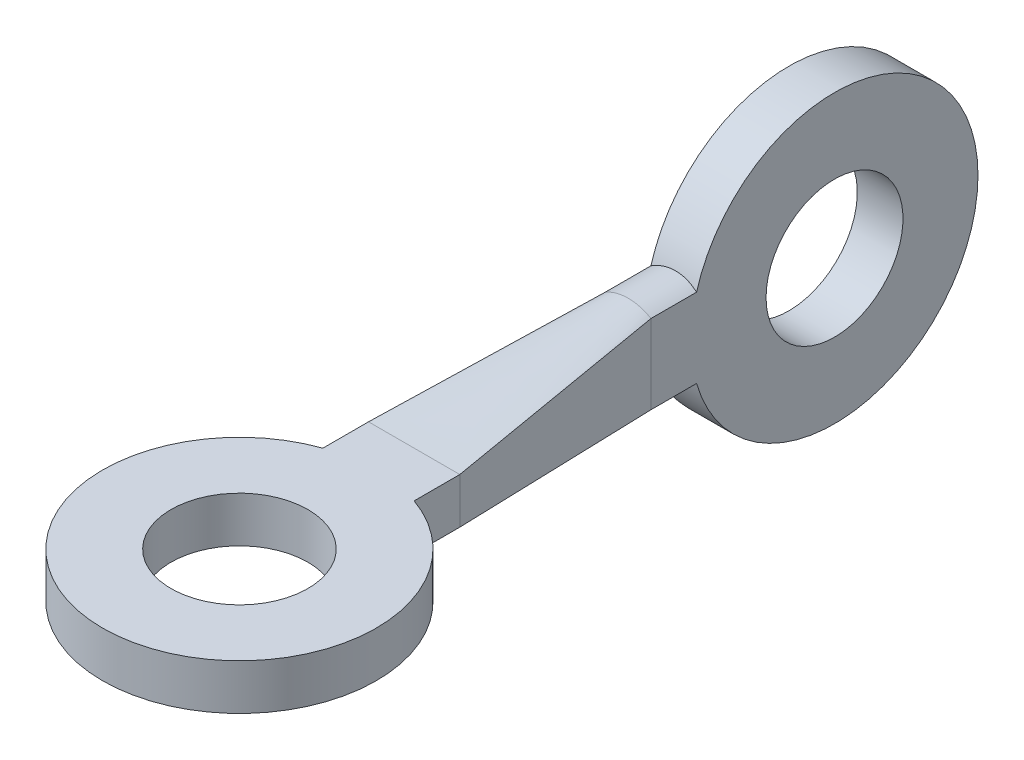
ISO-10303-21;
HEADER;
FILE_DESCRIPTION(('STEP AP214'),'2;1');
FILE_NAME('part.step','',(''),(''),'','','');
FILE_SCHEMA(('AUTOMOTIVE_DESIGN { 1 0 10303 214 1 1 1 1 }'));
ENDSEC;
DATA;
#1=APPLICATION_CONTEXT('core data for automotive mechanical design processes');
#2=APPLICATION_PROTOCOL_DEFINITION('international standard','automotive_design',2000,#1);
#3=PRODUCT_CONTEXT('',#1,'mechanical');
#4=PRODUCT('Part','Part','',(#3));
#5=PRODUCT_RELATED_PRODUCT_CATEGORY('part','',(#4));
#6=PRODUCT_DEFINITION_FORMATION('','',#4);
#7=PRODUCT_DEFINITION_CONTEXT('part definition',#1,'design');
#8=PRODUCT_DEFINITION('design','',#6,#7);
#9=PRODUCT_DEFINITION_SHAPE('','',#8);
#10=(LENGTH_UNIT() NAMED_UNIT(*) SI_UNIT(.MILLI.,.METRE.));
#11=(NAMED_UNIT(*) PLANE_ANGLE_UNIT() SI_UNIT($,.RADIAN.));
#12=(NAMED_UNIT(*) SI_UNIT($,.STERADIAN.) SOLID_ANGLE_UNIT());
#13=UNCERTAINTY_MEASURE_WITH_UNIT(LENGTH_MEASURE(1.E-05),#10,'distance_accuracy_value','');
#14=(GEOMETRIC_REPRESENTATION_CONTEXT(3) GLOBAL_UNCERTAINTY_ASSIGNED_CONTEXT((#13)) GLOBAL_UNIT_ASSIGNED_CONTEXT((#10,
#11,#12)) REPRESENTATION_CONTEXT('',''));
#15=CARTESIAN_POINT('',(0.,0.,0.));
#16=DIRECTION('',(0.,0.,1.));
#17=DIRECTION('',(1.,0.,0.));
#18=AXIS2_PLACEMENT_3D('',#15,#16,#17);
#19=CARTESIAN_POINT('',(0.,0.,40.));
#20=DIRECTION('',(0.,0.,-1.));
#21=DIRECTION('',(-1.,0.,0.));
#22=AXIS2_PLACEMENT_3D('',#19,#20,#21);
#23=CYLINDRICAL_SURFACE('',#22,2.);
#24=DIRECTION('',(0.,0.,1.));
#25=VECTOR('',#24,1.);
#26=CARTESIAN_POINT('',(1.,-1.73205080756888,-50.));
#27=LINE('',#26,#25);
#28=CARTESIAN_POINT('',(1.,-1.73205080756888,-49.9167094194033));
#29=VERTEX_POINT('',#28);
#30=CARTESIAN_POINT('',(1.,-1.73205080756888,-47.9202689102537));
#31=VERTEX_POINT('',#30);
#32=EDGE_CURVE('E279',#29,#31,#27,.T.);
#33=ORIENTED_EDGE('',*,*,#32,.T.);
#34=CARTESIAN_POINT('',(-0.999999999999999,-1.73205080756888,-47.9202689102538));
#35=CARTESIAN_POINT('',(-0.855662432702592,-1.81538414090221,-47.9202689102538));
#36=CARTESIAN_POINT('',(-0.695743587419121,-1.88327776752472,-47.9202689102538));
#37=CARTESIAN_POINT('',(-0.357154511713669,-1.97566063478784,-47.9202689102538));
#38=CARTESIAN_POINT('',(-0.17863279495408,-2.,-47.9202689102537));
#39=CARTESIAN_POINT('',(0.178632794954083,-2.,-47.9202689102538));
#40=CARTESIAN_POINT('',(0.357154511713672,-1.97566063478784,-47.9202689102538));
#41=CARTESIAN_POINT('',(0.695743587419124,-1.88327776752472,-47.9202689102538));
#42=CARTESIAN_POINT('',(0.855662432702595,-1.81538414090221,-47.9202689102538));
#43=CARTESIAN_POINT('',(1.,-1.73205080756888,-47.9202689102538));
#44=B_SPLINE_CURVE_WITH_KNOTS('',3,(#34,#35,#36,#37,#38,#39,#40,#41,#42,#43),.UNSPECIFIED.,.F.,
.F.,(4,2,2,2,4),(0.,0.25,0.5,0.75,1.),.UNSPECIFIED.);
#45=CARTESIAN_POINT('',(-0.999999999999999,-1.73205080756888,-47.9202689102538));
#46=VERTEX_POINT('',#45);
#47=EDGE_CURVE('E268',#31,#46,#44,.F.);
#48=ORIENTED_EDGE('',*,*,#47,.T.);
#49=DIRECTION('',(0.,0.,1.));
#50=VECTOR('',#49,1.);
#51=CARTESIAN_POINT('',(-1.,-1.73205080756888,-50.));
#52=LINE('',#51,#50);
#53=CARTESIAN_POINT('',(-1.,-1.73205080756888,-49.9167094194033));
#54=VERTEX_POINT('',#53);
#55=EDGE_CURVE('E63',#54,#46,#52,.T.);
#56=ORIENTED_EDGE('',*,*,#55,.F.);
#57=CARTESIAN_POINT('',(-2.,0.,-49.6734537981822));
#58=CARTESIAN_POINT('',(-1.99999958670003,-0.10940427922408,-49.6734541409433));
#59=CARTESIAN_POINT('',(-1.99099353960918,-0.218813304824866,-49.6763358688211));
#60=CARTESIAN_POINT('',(-1.95530584204708,-0.434425696098227,-49.6875489350859));
#61=CARTESIAN_POINT('',(-1.92862076452526,-0.540628436063382,-49.6958813300717));
#62=CARTESIAN_POINT('',(-1.85857027585872,-0.746688169215067,-49.7170867440767));
#63=CARTESIAN_POINT('',(-1.81523122951393,-0.846554903212941,-49.7299525835668));
#64=CARTESIAN_POINT('',(-1.71321704939282,-1.03760346199317,-49.7589004731303));
#65=CARTESIAN_POINT('',(-1.6545393336673,-1.12878382107406,-49.7749830645705));
#66=CARTESIAN_POINT('',(-1.52154589272172,-1.30277786649985,-49.8092344806702));
#67=CARTESIAN_POINT('',(-1.44682938468678,-1.38527598771562,-49.8274499619818));
#68=CARTESIAN_POINT('',(-1.2847322898229,-1.53680731356874,-49.8636475231072));
#69=CARTESIAN_POINT('',(-1.19734924257694,-1.60583789607319,-49.8816295568339));
#70=CARTESIAN_POINT('',(-1.00963926857056,-1.73020911334308,-49.9158281566154));
#71=CARTESIAN_POINT('',(-0.909036930347378,-1.78515136439131,-49.9319873236863));
#72=CARTESIAN_POINT('',(-0.699423233123488,-1.8772052413375,-49.960006841113));
#73=CARTESIAN_POINT('',(-0.590414189551318,-1.9143217567019,-49.9718683700596));
#74=CARTESIAN_POINT('',(-0.370649883361726,-1.96850822632186,-49.9894607287453));
#75=CARTESIAN_POINT('',(-0.260054082930835,-1.98616514667777,-49.9953705735451));
#76=CARTESIAN_POINT('',(-0.037324061015967,-2.00276531693824,-50.0009214261652));
#77=CARTESIAN_POINT('',(0.0748097259026973,-2.0017137484355,-50.0005641697524));
#78=CARTESIAN_POINT('',(0.29253866135017,-1.98138499683073,-49.9937789041836));
#79=CARTESIAN_POINT('',(0.398213073159152,-1.96285905377728,-49.9876011366861));
#80=CARTESIAN_POINT('',(0.604868116530266,-1.90932742516246,-49.9702782230478));
#81=CARTESIAN_POINT('',(0.705848231528714,-1.87431993065399,-49.9591325316552));
#82=CARTESIAN_POINT('',(0.902016076891211,-1.7882986691208,-49.9329413867494));
#83=CARTESIAN_POINT('',(0.997094102147248,-1.73705251719816,-49.9178399046554));
#84=CARTESIAN_POINT('',(1.17754541961867,-1.62016998865725,-49.8854638290231));
#85=CARTESIAN_POINT('',(1.26291610608373,-1.55452976200595,-49.8681886546076));
#86=CARTESIAN_POINT('',(1.42576989058637,-1.40705647447919,-49.8324128265761));
#87=CARTESIAN_POINT('',(1.5026895935095,-1.32460477849631,-49.8138928398112));
#88=CARTESIAN_POINT('',(1.6417498461887,-1.14774240790991,-49.7784325954715));
#89=CARTESIAN_POINT('',(1.70388922095101,-1.05333078344009,-49.7614924635558));
#90=CARTESIAN_POINT('',(1.81202514639368,-0.854114354785136,-49.730911592378));
#91=CARTESIAN_POINT('',(1.85788300117446,-0.749229570491273,-49.7172994946648));
#92=CARTESIAN_POINT('',(1.93113486538348,-0.532700073873293,-49.6951154118477));
#93=CARTESIAN_POINT('',(1.95853469132195,-0.421057503166261,-49.6865418391082));
#94=CARTESIAN_POINT('',(1.99312298969863,-0.198960469831808,-49.6756582643694));
#95=CARTESIAN_POINT('',(2.00107378392374,-0.0886361277998476,-49.6731121469158));
#96=CARTESIAN_POINT('',(1.99869348561917,0.131784600607327,-49.6738694714018));
#97=CARTESIAN_POINT('',(1.98836517070802,0.241881019071757,-49.6771720246014));
#98=CARTESIAN_POINT('',(1.95032964832314,0.455751361897044,-49.6891002440258));
#99=CARTESIAN_POINT('',(1.92307978298282,0.559615195436825,-49.6975857340805));
#100=CARTESIAN_POINT('',(1.85253631785648,0.761264458498393,-49.7188816185392));
#101=CARTESIAN_POINT('',(1.80924071646146,0.859049127903185,-49.7316925524984));
#102=CARTESIAN_POINT('',(1.70663143021575,1.04847548655247,-49.7607234783946));
#103=CARTESIAN_POINT('',(1.64694554719556,1.13990343587809,-49.7770204512685));
#104=CARTESIAN_POINT('',(1.51369400513522,1.31169963636845,-49.8111638102764));
#105=CARTESIAN_POINT('',(1.44012445435076,1.39206477555591,-49.8290106300904));
#106=CARTESIAN_POINT('',(1.27760775700532,1.54288860123637,-49.8651681565011));
#107=CARTESIAN_POINT('',(1.18815247044756,1.61280367907205,-49.883467739279));
#108=CARTESIAN_POINT('',(0.998382364090376,1.73668365743214,-49.9176959440001));
#109=CARTESIAN_POINT('',(0.898067656355469,1.79064872253235,-49.9336245904062));
#110=CARTESIAN_POINT('',(0.689574550646603,1.88078048347262,-49.9611351354301));
#111=CARTESIAN_POINT('',(0.581424767839512,1.91700853465307,-49.9727319849812));
#112=CARTESIAN_POINT('',(0.3601128402312,1.97060087749928,-49.9901496304489));
#113=CARTESIAN_POINT('',(0.246952710845481,1.98797268363016,-49.9959727272029));
#114=CARTESIAN_POINT('',(0.0245317466317054,2.00280723060671,-50.000937971976));
#115=CARTESIAN_POINT('',(-0.0846634488093431,2.00116442762922,-50.0003802895932));
#116=CARTESIAN_POINT('',(-0.301138930988915,1.98018666513643,-49.9933794113894));
#117=CARTESIAN_POINT('',(-0.408419312903888,1.9608525874826,-49.9869365089304));
#118=CARTESIAN_POINT('',(-0.616357174049056,1.90564917251096,-49.969104592412));
#119=CARTESIAN_POINT('',(-0.717092257773487,1.87004456532375,-49.9577949288054));
#120=CARTESIAN_POINT('',(-0.911238592146622,1.78352063125023,-49.9315265246381));
#121=CARTESIAN_POINT('',(-1.00464831019334,1.73259811029261,-49.916567023141));
#122=CARTESIAN_POINT('',(-1.18557149015125,1.61448352146309,-49.883931962669));
#123=CARTESIAN_POINT('',(-1.27269525765263,1.5467181588876,-49.8661712006051));
#124=CARTESIAN_POINT('',(-1.43462411871266,1.39783983796085,-49.8303171654653));
#125=CARTESIAN_POINT('',(-1.50942585866384,1.31672325786344,-49.8122238033522));
#126=CARTESIAN_POINT('',(-1.64715783792152,1.14010260243019,-49.7769993359435));
#127=CARTESIAN_POINT('',(-1.70959348727804,1.04420078347311,-49.7599224441907));
#128=CARTESIAN_POINT('',(-1.8173777437294,0.842721033412805,-49.7293496789503));
#129=CARTESIAN_POINT('',(-1.86273246888567,0.737146583739254,-49.7158525237826));
#130=CARTESIAN_POINT('',(-1.93213189839561,0.527399324323273,-49.6947906849293));
#131=CARTESIAN_POINT('',(-1.95750704908768,0.423702740779572,-49.6868604054561));
#132=CARTESIAN_POINT('',(-1.99143945048468,0.213338502760021,-49.6761923664431));
#133=CARTESIAN_POINT('',(-2.00000040297629,0.106671507490969,-49.6734534639827));
#134=CARTESIAN_POINT('',(-2.,0.,-49.6734537981822));
#135=B_SPLINE_CURVE_WITH_KNOTS('',3,(#57,#58,#59,#60,#61,#62,#63,#64,#65,#66,#67,#68,#69,#70,
#71,#72,#73,#74,#75,#76,#77,#78,#79,#80,#81,#82,#83,#84,#85,#86,#87,#88,#89,#90,#91,#92,#93,#94,
#95,#96,#97,#98,#99,#100,#101,#102,#103,#104,#105,#106,#107,#108,#109,#110,#111,#112,#113,#114,
#115,#116,#117,#118,#119,#120,#121,#122,#123,#124,#125,#126,#127,#128,#129,#130,#131,#132,#133,
#134),.UNSPECIFIED.,.T.,.F.,(4,2,2,2,2,2,2,2,2,2,2,2,2,2,2,2,2,2,2,2,2,2,2,2,2,2,2,2,2,2,2,2,2,
2,2,2,2,2,4),(0.,0.327820628580541,0.655704823244681,0.983072070686562,1.3104944591894,
1.64732198851296,1.98421503293001,2.32978494808253,2.67526002177035,3.01000216474727,
3.34465159738033,3.66553979346283,3.98646321712342,4.31220408633315,4.63803218908533,
4.97925793983085,5.32051080798706,5.66460461185119,6.00858993378931,6.33885960016352,
6.66907908442112,6.99074034514751,7.31244174469331,7.64215795577247,7.971966727574,
8.31534461543778,8.65871896012813,9.00089697157971,9.34293857040924,9.66895839721077,
9.99496197370422,10.3158404308718,10.6367858436304,10.9706741882154,11.3046532554536,
11.6500758990744,11.995374700952,12.3150772042684,12.6347093145052),.UNSPECIFIED.);
#136=EDGE_CURVE('E274',#54,#29,#135,.T.);
#137=ORIENTED_EDGE('',*,*,#136,.T.);
#138=EDGE_LOOP('',(#33,#48,#56,#137));
#139=FACE_BOUND('',#138,.T.);
#140=ADVANCED_FACE('F53',(#139),#23,.T.);
#141=CARTESIAN_POINT('',(-1.,-1.73205080756888,-50.));
#142=DIRECTION('',(1.,0.,0.));
#143=DIRECTION('',(0.,0.,-1.));
#144=AXIS2_PLACEMENT_3D('',#141,#142,#143);
#145=PLANE('',#144);
#146=CARTESIAN_POINT('',(-1.,0.,-55.9614344867655));
#147=DIRECTION('',(-1.,0.,0.));
#148=DIRECTION('',(0.,0.,1.));
#149=AXIS2_PLACEMENT_3D('',#146,#147,#148);
#150=CIRCLE('',#149,3.);
#151=CARTESIAN_POINT('',(-1.,0.,-52.9614344867655));
#152=VERTEX_POINT('',#151);
#153=EDGE_CURVE('E265',#152,#152,#150,.T.);
#154=ORIENTED_EDGE('',*,*,#153,.F.);
#155=EDGE_LOOP('',(#154));
#156=FACE_BOUND('',#155,.T.);
#157=ORIENTED_EDGE('',*,*,#55,.T.);
#158=DIRECTION('',(0.,1.,0.));
#159=VECTOR('',#158,1.);
#160=CARTESIAN_POINT('',(-1.,0.,-47.9202689102538));
#161=LINE('',#160,#159);
#162=CARTESIAN_POINT('',(-1.,1.73205080756888,-47.9202689102538));
#163=VERTEX_POINT('',#162);
#164=EDGE_CURVE('E211',#163,#46,#161,.F.);
#165=ORIENTED_EDGE('',*,*,#164,.F.);
#166=DIRECTION('',(0.,0.,1.));
#167=VECTOR('',#166,1.);
#168=CARTESIAN_POINT('',(-1.,1.73205080756888,-50.));
#169=LINE('',#168,#167);
#170=CARTESIAN_POINT('',(-1.,1.73205080756888,-49.9167094194033));
#171=VERTEX_POINT('',#170);
#172=EDGE_CURVE('E303',#171,#163,#169,.T.);
#173=ORIENTED_EDGE('',*,*,#172,.F.);
#174=CARTESIAN_POINT('',(-1.,0.,-55.9614344867655));
#175=DIRECTION('',(-1.,0.,0.));
#176=DIRECTION('',(0.,0.,1.));
#177=AXIS2_PLACEMENT_3D('',#174,#175,#176);
#178=CIRCLE('',#177,6.28798068858332);
#179=EDGE_CURVE('E264',#171,#54,#178,.T.);
#180=ORIENTED_EDGE('',*,*,#179,.T.);
#181=EDGE_LOOP('',(#157,#165,#173,#180));
#182=FACE_BOUND('',#181,.T.);
#183=ADVANCED_FACE('F292',(#156,#182),#145,.F.);
#184=CARTESIAN_POINT('',(1.,-1.73205080756888,-50.));
#185=DIRECTION('',(-1.,0.,0.));
#186=DIRECTION('',(0.,0.,1.));
#187=AXIS2_PLACEMENT_3D('',#184,#185,#186);
#188=PLANE('',#187);
#189=CARTESIAN_POINT('',(1.,0.,-55.9614344867655));
#190=DIRECTION('',(-1.,0.,0.));
#191=DIRECTION('',(0.,0.,1.));
#192=AXIS2_PLACEMENT_3D('',#189,#190,#191);
#193=CIRCLE('',#192,3.);
#194=CARTESIAN_POINT('',(1.,0.,-52.9614344867655));
#195=VERTEX_POINT('',#194);
#196=EDGE_CURVE('E261',#195,#195,#193,.T.);
#197=ORIENTED_EDGE('',*,*,#196,.T.);
#198=EDGE_LOOP('',(#197));
#199=FACE_BOUND('',#198,.T.);
#200=DIRECTION('',(0.,0.,1.));
#201=VECTOR('',#200,1.);
#202=CARTESIAN_POINT('',(1.,1.73205080756888,-50.));
#203=LINE('',#202,#201);
#204=CARTESIAN_POINT('',(1.,1.73205080756888,-49.9167094194033));
#205=VERTEX_POINT('',#204);
#206=CARTESIAN_POINT('',(1.,1.73205080756888,-47.9202689102538));
#207=VERTEX_POINT('',#206);
#208=EDGE_CURVE('E305',#205,#207,#203,.T.);
#209=ORIENTED_EDGE('',*,*,#208,.T.);
#210=DIRECTION('',(0.,1.,0.));
#211=VECTOR('',#210,1.);
#212=CARTESIAN_POINT('',(1.,-1.73205080756888,-47.9202689102537));
#213=LINE('',#212,#211);
#214=EDGE_CURVE('E321',#207,#31,#213,.F.);
#215=ORIENTED_EDGE('',*,*,#214,.T.);
#216=ORIENTED_EDGE('',*,*,#32,.F.);
#217=CARTESIAN_POINT('',(1.,0.,-55.9614344867655));
#218=DIRECTION('',(-1.,0.,0.));
#219=DIRECTION('',(0.,0.,1.));
#220=AXIS2_PLACEMENT_3D('',#217,#218,#219);
#221=CIRCLE('',#220,6.28798068858332);
#222=EDGE_CURVE('E269',#29,#205,#221,.F.);
#223=ORIENTED_EDGE('',*,*,#222,.T.);
#224=EDGE_LOOP('',(#209,#215,#216,#223));
#225=FACE_BOUND('',#224,.T.);
#226=ADVANCED_FACE('F290',(#199,#225),#188,.F.);
#227=ORIENTED_EDGE('',*,*,#172,.T.);
#228=CARTESIAN_POINT('',(1.,1.73205080756888,-47.9202689102538));
#229=CARTESIAN_POINT('',(0.855662432702593,1.81538414090221,-47.9202689102538));
#230=CARTESIAN_POINT('',(0.695743587419122,1.88327776752472,-47.9202689102538));
#231=CARTESIAN_POINT('',(0.35715451171367,1.97566063478784,-47.9202689102538));
#232=CARTESIAN_POINT('',(0.178632794954082,2.,-47.9202689102537));
#233=CARTESIAN_POINT('',(-0.178632794954082,2.,-47.9202689102538));
#234=CARTESIAN_POINT('',(-0.35715451171367,1.97566063478784,-47.9202689102538));
#235=CARTESIAN_POINT('',(-0.695743587419122,1.88327776752472,-47.9202689102538));
#236=CARTESIAN_POINT('',(-0.855662432702593,1.81538414090221,-47.9202689102538));
#237=CARTESIAN_POINT('',(-1.,1.73205080756888,-47.9202689102538));
#238=B_SPLINE_CURVE_WITH_KNOTS('',3,(#228,#229,#230,#231,#232,#233,#234,#235,#236,#237),
.UNSPECIFIED.,.F.,.F.,(4,2,2,2,4),(0.,0.25,0.5,0.75,1.),.UNSPECIFIED.);
#239=EDGE_CURVE('E12',#163,#207,#238,.F.);
#240=ORIENTED_EDGE('',*,*,#239,.T.);
#241=ORIENTED_EDGE('',*,*,#208,.F.);
#242=EDGE_CURVE('E77',#205,#171,#135,.T.);
#243=ORIENTED_EDGE('',*,*,#242,.T.);
#244=EDGE_LOOP('',(#227,#240,#241,#243));
#245=FACE_BOUND('',#244,.T.);
#246=ADVANCED_FACE('F287',(#245),#23,.T.);
#247=CARTESIAN_POINT('',(18.7850951394693,0.,-55.9614344867655));
#248=DIRECTION('',(-1.,0.,0.));
#249=DIRECTION('',(0.,0.,1.));
#250=AXIS2_PLACEMENT_3D('',#247,#248,#249);
#251=CYLINDRICAL_SURFACE('',#250,6.28798068858332);
#252=ORIENTED_EDGE('',*,*,#136,.F.);
#253=ORIENTED_EDGE('',*,*,#179,.F.);
#254=ORIENTED_EDGE('',*,*,#242,.F.);
#255=ORIENTED_EDGE('',*,*,#222,.F.);
#256=EDGE_LOOP('',(#252,#253,#254,#255));
#257=FACE_BOUND('',#256,.T.);
#258=ADVANCED_FACE('F282',(#257),#251,.T.);
#259=CARTESIAN_POINT('',(1.,0.,-55.9614344867655));
#260=DIRECTION('',(-1.,0.,0.));
#261=DIRECTION('',(0.,0.,1.));
#262=AXIS2_PLACEMENT_3D('',#259,#260,#261);
#263=CYLINDRICAL_SURFACE('',#262,3.);
#264=ORIENTED_EDGE('',*,*,#196,.F.);
#265=EDGE_LOOP('',(#264));
#266=FACE_BOUND('',#265,.T.);
#267=ORIENTED_EDGE('',*,*,#153,.T.);
#268=EDGE_LOOP('',(#267));
#269=FACE_BOUND('',#268,.T.);
#270=ADVANCED_FACE('F183',(#266,#269),#263,.F.);
#271=CARTESIAN_POINT('',(-1.99999999999999,1.,-38.5402689102537));
#272=CARTESIAN_POINT('',(-1.,1.73205080756888,-47.9202689102538));
#273=CARTESIAN_POINT('',(-1.66666666666666,1.,-38.5402689102537));
#274=CARTESIAN_POINT('',(-0.855662432702593,1.81538414090221,-47.9202689102538));
#275=CARTESIAN_POINT('',(-1.33333333333333,1.,-38.5402689102537));
#276=CARTESIAN_POINT('',(-0.695743587419122,1.88327776752472,-47.9202689102538));
#277=CARTESIAN_POINT('',(-0.66666666666666,1.,-38.5402689102537));
#278=CARTESIAN_POINT('',(-0.35715451171367,1.97566063478784,-47.9202689102538));
#279=CARTESIAN_POINT('',(-0.333333333333326,1.,-38.5402689102537));
#280=CARTESIAN_POINT('',(-0.178632794954082,2.,-47.9202689102538));
#281=CARTESIAN_POINT('',(0.33333333333334,1.,-38.5402689102537));
#282=CARTESIAN_POINT('',(0.178632794954082,2.,-47.9202689102537));
#283=CARTESIAN_POINT('',(0.666666666666674,1.,-38.5402689102537));
#284=CARTESIAN_POINT('',(0.35715451171367,1.97566063478784,-47.9202689102538));
#285=CARTESIAN_POINT('',(1.33333333333334,1.,-38.5402689102537));
#286=CARTESIAN_POINT('',(0.695743587419122,1.88327776752472,-47.9202689102538));
#287=CARTESIAN_POINT('',(1.66666666666667,1.,-38.5402689102537));
#288=CARTESIAN_POINT('',(0.855662432702593,1.81538414090221,-47.9202689102538));
#289=CARTESIAN_POINT('',(2.00000000000001,1.,-38.5402689102537));
#290=CARTESIAN_POINT('',(1.,1.73205080756888,-47.9202689102538));
#291=B_SPLINE_SURFACE_WITH_KNOTS('',3,1,((#271,#272),(#273,#274),(#275,#276),(#277,#278),(#279,
#280),(#281,#282),(#283,#284),(#285,#286),(#287,#288),(#289,#290)),.UNSPECIFIED.,.F.,.F.,.F.,(4,
2,2,2,4),(2,2),(0.,0.25,0.5,0.75,1.),(0.,1.),.UNSPECIFIED.);
#292=DIRECTION('',(-1.,0.,0.));
#293=VECTOR('',#292,1.);
#294=CARTESIAN_POINT('',(-1.99999999999999,1.,-38.5402689102537));
#295=LINE('',#294,#293);
#296=CARTESIAN_POINT('',(2.00000000000001,1.,-38.5402689102537));
#297=VERTEX_POINT('',#296);
#298=CARTESIAN_POINT('',(-1.99999999999999,1.,-38.5402689102537));
#299=VERTEX_POINT('',#298);
#300=EDGE_CURVE('E143',#297,#299,#295,.T.);
#301=DIRECTION('',(-0.105691299929436,0.0773714014663475,-0.991384393338103));
#302=VECTOR('',#301,1.);
#303=CARTESIAN_POINT('',(1.5,1.36602540378444,-43.2302689102537));
#304=LINE('',#303,#302);
#305=EDGE_CURVE('E527',#297,#207,#304,.T.);
#306=DIRECTION('',(-0.105691299929434,-0.0773714014663475,0.991384393338103));
#307=VECTOR('',#306,1.);
#308=CARTESIAN_POINT('',(-1.5,1.36602540378444,-43.2302689102537));
#309=LINE('',#308,#307);
#310=EDGE_CURVE('E168',#163,#299,#309,.T.);
#311=ORIENTED_EDGE('',*,*,#300,.F.);
#312=ORIENTED_EDGE('',*,*,#305,.T.);
#313=ORIENTED_EDGE('',*,*,#239,.F.);
#314=ORIENTED_EDGE('',*,*,#310,.T.);
#315=EDGE_LOOP('',(#311,#312,#313,#314));
#316=FACE_BOUND('',#315,.T.);
#317=ADVANCED_FACE('F170',(#316),#291,.T.);
#318=CARTESIAN_POINT('',(6.04012076699043,0.,-0.643936115883845));
#319=DIRECTION('',(-0.994365161874777,0.,0.106009079091128));
#320=DIRECTION('',(0.106009079091128,0.,0.994365161874777));
#321=AXIS2_PLACEMENT_3D('',#318,#319,#320);
#322=PLANE('',#321);
#323=DIRECTION('',(-0.105691299929436,-0.0773714014663475,-0.991384393338103));
#324=VECTOR('',#323,1.);
#325=CARTESIAN_POINT('',(2.00000000000001,-1.,-38.5402689102537));
#326=LINE('',#325,#324);
#327=CARTESIAN_POINT('',(2.00000000000001,-1.,-38.5402689102537));
#328=VERTEX_POINT('',#327);
#329=EDGE_CURVE('E355',#328,#31,#326,.T.);
#330=ORIENTED_EDGE('',*,*,#329,.T.);
#331=ORIENTED_EDGE('',*,*,#214,.F.);
#332=ORIENTED_EDGE('',*,*,#305,.F.);
#333=DIRECTION('',(0.,1.,0.));
#334=VECTOR('',#333,1.);
#335=CARTESIAN_POINT('',(2.00000000000001,1.,-38.5402689102537));
#336=LINE('',#335,#334);
#337=EDGE_CURVE('E212',#328,#297,#336,.T.);
#338=ORIENTED_EDGE('',*,*,#337,.F.);
#339=EDGE_LOOP('',(#330,#331,#332,#338));
#340=FACE_BOUND('',#339,.T.);
#341=ADVANCED_FACE('F182',(#340),#322,.F.);
#342=CARTESIAN_POINT('',(-6.04012076699036,0.,-0.643936115883829));
#343=DIRECTION('',(-0.994365161874777,0.,-0.106009079091127));
#344=DIRECTION('',(-0.106009079091127,0.,0.994365161874777));
#345=AXIS2_PLACEMENT_3D('',#342,#343,#344);
#346=PLANE('',#345);
#347=ORIENTED_EDGE('',*,*,#310,.F.);
#348=ORIENTED_EDGE('',*,*,#164,.T.);
#349=DIRECTION('',(0.105691299929435,-0.0773714014663475,-0.991384393338103));
#350=VECTOR('',#349,1.);
#351=CARTESIAN_POINT('',(-1.5,-1.36602540378444,-43.2302689102537));
#352=LINE('',#351,#350);
#353=CARTESIAN_POINT('',(-1.99999999999999,-1.,-38.5402689102537));
#354=VERTEX_POINT('',#353);
#355=EDGE_CURVE('E352',#354,#46,#352,.T.);
#356=ORIENTED_EDGE('',*,*,#355,.F.);
#357=DIRECTION('',(0.,-1.,0.));
#358=VECTOR('',#357,1.);
#359=CARTESIAN_POINT('',(-1.99999999999999,1.,-38.5402689102537));
#360=LINE('',#359,#358);
#361=EDGE_CURVE('E57',#299,#354,#360,.T.);
#362=ORIENTED_EDGE('',*,*,#361,.F.);
#363=EDGE_LOOP('',(#347,#348,#356,#362));
#364=FACE_BOUND('',#363,.T.);
#365=ADVANCED_FACE('F350',(#364),#346,.T.);
#366=CARTESIAN_POINT('',(2.00000000000001,-1.,-38.5402689102537));
#367=CARTESIAN_POINT('',(1.,-1.73205080756888,-47.9202689102538));
#368=CARTESIAN_POINT('',(1.66666666666667,-1.,-38.5402689102537));
#369=CARTESIAN_POINT('',(0.855662432702595,-1.81538414090221,-47.9202689102538));
#370=CARTESIAN_POINT('',(1.33333333333334,-1.,-38.5402689102537));
#371=CARTESIAN_POINT('',(0.695743587419124,-1.88327776752472,-47.9202689102538));
#372=CARTESIAN_POINT('',(0.666666666666676,-1.,-38.5402689102537));
#373=CARTESIAN_POINT('',(0.357154511713672,-1.97566063478784,-47.9202689102538));
#374=CARTESIAN_POINT('',(0.333333333333343,-1.,-38.5402689102537));
#375=CARTESIAN_POINT('',(0.178632794954083,-2.,-47.9202689102538));
#376=CARTESIAN_POINT('',(-0.333333333333324,-1.,-38.5402689102537));
#377=CARTESIAN_POINT('',(-0.17863279495408,-2.,-47.9202689102537));
#378=CARTESIAN_POINT('',(-0.666666666666658,-1.,-38.5402689102537));
#379=CARTESIAN_POINT('',(-0.357154511713669,-1.97566063478784,-47.9202689102538));
#380=CARTESIAN_POINT('',(-1.33333333333333,-1.,-38.5402689102537));
#381=CARTESIAN_POINT('',(-0.695743587419121,-1.88327776752472,-47.9202689102538));
#382=CARTESIAN_POINT('',(-1.66666666666666,-1.,-38.5402689102537));
#383=CARTESIAN_POINT('',(-0.855662432702592,-1.81538414090221,-47.9202689102538));
#384=CARTESIAN_POINT('',(-1.99999999999999,-1.,-38.5402689102537));
#385=CARTESIAN_POINT('',(-0.999999999999999,-1.73205080756888,-47.9202689102538));
#386=B_SPLINE_SURFACE_WITH_KNOTS('',3,1,((#366,#367),(#368,#369),(#370,#371),(#372,#373),(#374,
#375),(#376,#377),(#378,#379),(#380,#381),(#382,#383),(#384,#385)),.UNSPECIFIED.,.F.,.F.,.F.,(4,
2,2,2,4),(2,2),(0.,0.25,0.5,0.75,1.),(0.,1.),.UNSPECIFIED.);
#387=DIRECTION('',(1.,0.,0.));
#388=VECTOR('',#387,1.);
#389=CARTESIAN_POINT('',(-1.99999999999999,-1.,-38.5402689102537));
#390=LINE('',#389,#388);
#391=EDGE_CURVE('E249',#354,#328,#390,.T.);
#392=ORIENTED_EDGE('',*,*,#391,.F.);
#393=ORIENTED_EDGE('',*,*,#355,.T.);
#394=ORIENTED_EDGE('',*,*,#47,.F.);
#395=ORIENTED_EDGE('',*,*,#329,.F.);
#396=EDGE_LOOP('',(#392,#393,#394,#395));
#397=FACE_BOUND('',#396,.T.);
#398=ADVANCED_FACE('F353',(#397),#386,.T.);
#399=CARTESIAN_POINT('',(-1.99999999999999,1.,-36.5402689102537));
#400=DIRECTION('',(1.,0.,0.));
#401=DIRECTION('',(0.,0.,-1.));
#402=AXIS2_PLACEMENT_3D('',#399,#400,#401);
#403=PLANE('',#402);
#404=ORIENTED_EDGE('',*,*,#361,.T.);
#405=DIRECTION('',(0.,0.,-1.));
#406=VECTOR('',#405,1.);
#407=CARTESIAN_POINT('',(-1.99999999999999,-1.,-36.5402689102537));
#408=LINE('',#407,#406);
#409=CARTESIAN_POINT('',(-1.99999999999999,-1.,-36.5402689102537));
#410=VERTEX_POINT('',#409);
#411=EDGE_CURVE('E127',#410,#354,#408,.T.);
#412=ORIENTED_EDGE('',*,*,#411,.F.);
#413=DIRECTION('',(0.,-1.,0.));
#414=VECTOR('',#413,1.);
#415=CARTESIAN_POINT('',(-1.99999999999999,1.,-36.5402689102537));
#416=LINE('',#415,#414);
#417=CARTESIAN_POINT('',(-1.99999999999999,1.,-36.5402689102537));
#418=VERTEX_POINT('',#417);
#419=EDGE_CURVE('E121',#418,#410,#416,.T.);
#420=ORIENTED_EDGE('',*,*,#419,.F.);
#421=DIRECTION('',(0.,0.,-1.));
#422=VECTOR('',#421,1.);
#423=CARTESIAN_POINT('',(-1.99999999999999,1.,-36.5402689102537));
#424=LINE('',#423,#422);
#425=EDGE_CURVE('E125',#418,#299,#424,.T.);
#426=ORIENTED_EDGE('',*,*,#425,.T.);
#427=EDGE_LOOP('',(#404,#412,#420,#426));
#428=FACE_BOUND('',#427,.T.);
#429=ADVANCED_FACE('F124',(#428),#403,.F.);
#430=CARTESIAN_POINT('',(-1.99999999999999,-1.,-36.5402689102537));
#431=DIRECTION('',(0.,1.,0.));
#432=DIRECTION('',(0.,0.,1.));
#433=AXIS2_PLACEMENT_3D('',#430,#431,#432);
#434=PLANE('',#433);
#435=DIRECTION('',(0.,0.,-1.));
#436=VECTOR('',#435,1.);
#437=CARTESIAN_POINT('',(2.00000000000001,-1.,-36.5402689102537));
#438=LINE('',#437,#436);
#439=CARTESIAN_POINT('',(2.00000000000001,-1.,-36.5402689102537));
#440=VERTEX_POINT('',#439);
#441=EDGE_CURVE('E217',#440,#328,#438,.T.);
#442=ORIENTED_EDGE('',*,*,#441,.F.);
#443=CARTESIAN_POINT('',(0.,-1.,-30.8834146607614));
#444=DIRECTION('',(0.,-1.,0.));
#445=DIRECTION('',(0.,0.,-1.));
#446=AXIS2_PLACEMENT_3D('',#443,#444,#445);
#447=CIRCLE('',#446,6.);
#448=EDGE_CURVE('E150',#440,#410,#447,.T.);
#449=ORIENTED_EDGE('',*,*,#448,.T.);
#450=ORIENTED_EDGE('',*,*,#411,.T.);
#451=ORIENTED_EDGE('',*,*,#391,.T.);
#452=EDGE_LOOP('',(#442,#449,#450,#451));
#453=FACE_BOUND('',#452,.T.);
#454=CARTESIAN_POINT('',(0.,-1.,-30.8834146607614));
#455=DIRECTION('',(0.,-1.,0.));
#456=DIRECTION('',(0.,0.,-1.));
#457=AXIS2_PLACEMENT_3D('',#454,#455,#456);
#458=CIRCLE('',#457,3.);
#459=CARTESIAN_POINT('',(0.,-1.,-33.8834146607614));
#460=VERTEX_POINT('',#459);
#461=EDGE_CURVE('E154',#460,#460,#458,.T.);
#462=ORIENTED_EDGE('',*,*,#461,.F.);
#463=EDGE_LOOP('',(#462));
#464=FACE_BOUND('',#463,.T.);
#465=ADVANCED_FACE('F236',(#453,#464),#434,.F.);
#466=CARTESIAN_POINT('',(2.00000000000001,1.,-36.5402689102537));
#467=DIRECTION('',(-1.,0.,0.));
#468=DIRECTION('',(0.,0.,1.));
#469=AXIS2_PLACEMENT_3D('',#466,#467,#468);
#470=PLANE('',#469);
#471=ORIENTED_EDGE('',*,*,#337,.T.);
#472=DIRECTION('',(0.,0.,-1.));
#473=VECTOR('',#472,1.);
#474=CARTESIAN_POINT('',(2.00000000000001,1.,-36.5402689102537));
#475=LINE('',#474,#473);
#476=CARTESIAN_POINT('',(2.00000000000001,1.,-36.5402689102537));
#477=VERTEX_POINT('',#476);
#478=EDGE_CURVE('E145',#477,#297,#475,.T.);
#479=ORIENTED_EDGE('',*,*,#478,.F.);
#480=DIRECTION('',(0.,1.,0.));
#481=VECTOR('',#480,1.);
#482=CARTESIAN_POINT('',(2.00000000000001,1.,-36.5402689102537));
#483=LINE('',#482,#481);
#484=EDGE_CURVE('E132',#440,#477,#483,.T.);
#485=ORIENTED_EDGE('',*,*,#484,.F.);
#486=ORIENTED_EDGE('',*,*,#441,.T.);
#487=EDGE_LOOP('',(#471,#479,#485,#486));
#488=FACE_BOUND('',#487,.T.);
#489=ADVANCED_FACE('F228',(#488),#470,.F.);
#490=CARTESIAN_POINT('',(-1.99999999999999,1.,-36.5402689102537));
#491=DIRECTION('',(0.,-1.,0.));
#492=DIRECTION('',(0.,0.,-1.));
#493=AXIS2_PLACEMENT_3D('',#490,#491,#492);
#494=PLANE('',#493);
#495=ORIENTED_EDGE('',*,*,#425,.F.);
#496=CARTESIAN_POINT('',(0.,1.,-30.8834146607614));
#497=DIRECTION('',(0.,-1.,0.));
#498=DIRECTION('',(0.,0.,-1.));
#499=AXIS2_PLACEMENT_3D('',#496,#497,#498);
#500=CIRCLE('',#499,6.);
#501=EDGE_CURVE('E141',#418,#477,#500,.F.);
#502=ORIENTED_EDGE('',*,*,#501,.T.);
#503=ORIENTED_EDGE('',*,*,#478,.T.);
#504=ORIENTED_EDGE('',*,*,#300,.T.);
#505=EDGE_LOOP('',(#495,#502,#503,#504));
#506=FACE_BOUND('',#505,.T.);
#507=CARTESIAN_POINT('',(0.,1.,-30.8834146607614));
#508=DIRECTION('',(0.,-1.,0.));
#509=DIRECTION('',(0.,0.,-1.));
#510=AXIS2_PLACEMENT_3D('',#507,#508,#509);
#511=CIRCLE('',#510,3.);
#512=CARTESIAN_POINT('',(0.,1.,-33.8834146607614));
#513=VERTEX_POINT('',#512);
#514=EDGE_CURVE('E133',#513,#513,#511,.F.);
#515=ORIENTED_EDGE('',*,*,#514,.F.);
#516=EDGE_LOOP('',(#515));
#517=FACE_BOUND('',#516,.T.);
#518=ADVANCED_FACE('F138',(#506,#517),#494,.F.);
#519=CARTESIAN_POINT('',(0.,17.9705627484771,-30.8834146607614));
#520=DIRECTION('',(0.,-1.,0.));
#521=DIRECTION('',(0.,0.,-1.));
#522=AXIS2_PLACEMENT_3D('',#519,#520,#521);
#523=CYLINDRICAL_SURFACE('',#522,6.);
#524=ORIENTED_EDGE('',*,*,#501,.F.);
#525=ORIENTED_EDGE('',*,*,#419,.T.);
#526=ORIENTED_EDGE('',*,*,#448,.F.);
#527=ORIENTED_EDGE('',*,*,#484,.T.);
#528=EDGE_LOOP('',(#524,#525,#526,#527));
#529=FACE_BOUND('',#528,.T.);
#530=ADVANCED_FACE('F148',(#529),#523,.T.);
#531=CARTESIAN_POINT('',(0.,17.9705627484771,-30.8834146607614));
#532=DIRECTION('',(0.,-1.,0.));
#533=DIRECTION('',(0.,0.,-1.));
#534=AXIS2_PLACEMENT_3D('',#531,#532,#533);
#535=CYLINDRICAL_SURFACE('',#534,3.);
#536=ORIENTED_EDGE('',*,*,#514,.T.);
#537=EDGE_LOOP('',(#536));
#538=FACE_BOUND('',#537,.T.);
#539=ORIENTED_EDGE('',*,*,#461,.T.);
#540=EDGE_LOOP('',(#539));
#541=FACE_BOUND('',#540,.T.);
#542=ADVANCED_FACE('F415',(#538,#541),#535,.F.);
#543=CLOSED_SHELL('',(#140,#183,#226,#246,#258,#270,#317,#341,#365,#398,#429,#465,#489,#518,
#530,#542));
#544=MANIFOLD_SOLID_BREP('B2',#543);
#545=ADVANCED_BREP_SHAPE_REPRESENTATION('',(#18,#544),#14);
#546=SHAPE_DEFINITION_REPRESENTATION(#9,#545);
ENDSEC;
END-ISO-10303-21;
